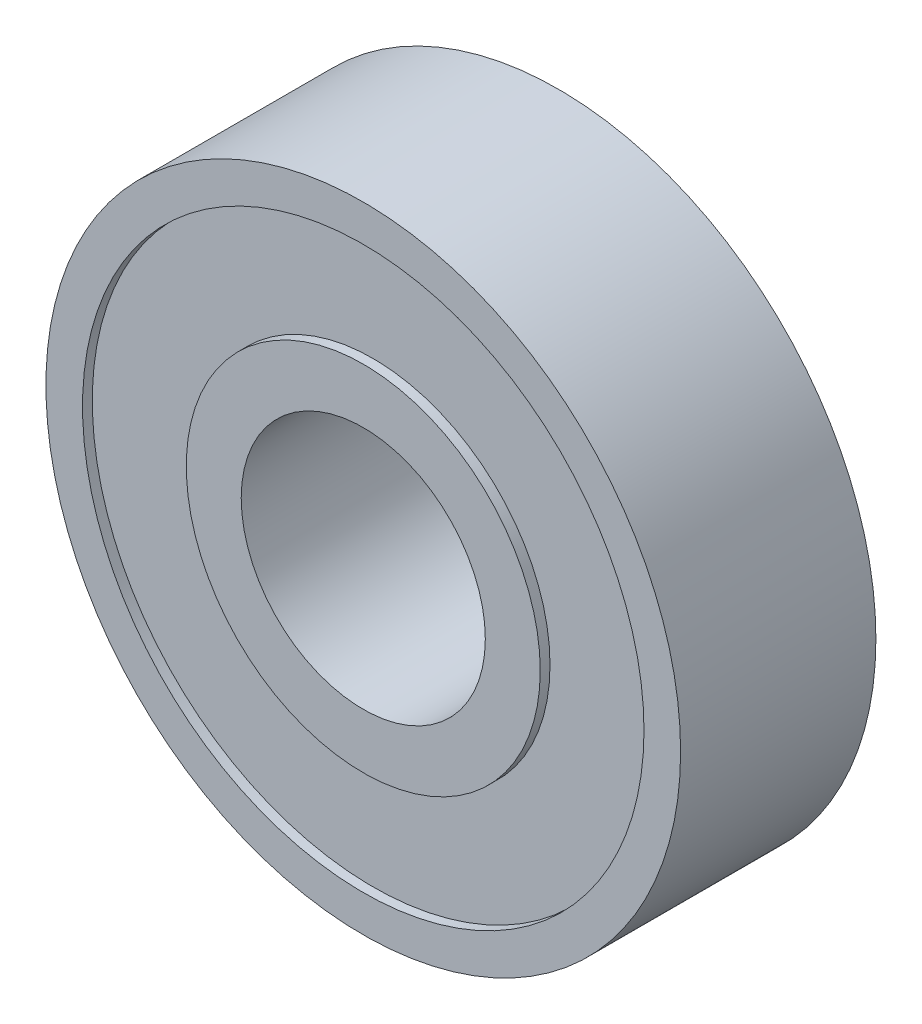
ISO-10303-21;
HEADER;
FILE_DESCRIPTION(('STEP AP214'),'2;1');
FILE_NAME('part.step','',(''),(''),'','','');
FILE_SCHEMA(('AUTOMOTIVE_DESIGN { 1 0 10303 214 1 1 1 1 }'));
ENDSEC;
DATA;
#1=APPLICATION_CONTEXT('core data for automotive mechanical design processes');
#2=APPLICATION_PROTOCOL_DEFINITION('international standard','automotive_design',2000,#1);
#3=PRODUCT_CONTEXT('',#1,'mechanical');
#4=PRODUCT('Part','Part','',(#3));
#5=PRODUCT_RELATED_PRODUCT_CATEGORY('part','',(#4));
#6=PRODUCT_DEFINITION_FORMATION('','',#4);
#7=PRODUCT_DEFINITION_CONTEXT('part definition',#1,'design');
#8=PRODUCT_DEFINITION('design','',#6,#7);
#9=PRODUCT_DEFINITION_SHAPE('','',#8);
#10=(LENGTH_UNIT() NAMED_UNIT(*) SI_UNIT(.MILLI.,.METRE.));
#11=(NAMED_UNIT(*) PLANE_ANGLE_UNIT() SI_UNIT($,.RADIAN.));
#12=(NAMED_UNIT(*) SI_UNIT($,.STERADIAN.) SOLID_ANGLE_UNIT());
#13=UNCERTAINTY_MEASURE_WITH_UNIT(LENGTH_MEASURE(1.E-05),#10,'distance_accuracy_value','');
#14=(GEOMETRIC_REPRESENTATION_CONTEXT(3) GLOBAL_UNCERTAINTY_ASSIGNED_CONTEXT((#13)) GLOBAL_UNIT_ASSIGNED_CONTEXT((#10,
#11,#12)) REPRESENTATION_CONTEXT('',''));
#15=CARTESIAN_POINT('',(0.,0.,0.));
#16=DIRECTION('',(0.,0.,1.));
#17=DIRECTION('',(1.,0.,0.));
#18=AXIS2_PLACEMENT_3D('',#15,#16,#17);
#19=CARTESIAN_POINT('',(0.,0.,-4.));
#20=DIRECTION('',(0.,0.,1.));
#21=DIRECTION('',(1.,0.,0.));
#22=AXIS2_PLACEMENT_3D('',#19,#20,#21);
#23=PLANE('',#22);
#24=CARTESIAN_POINT('',(0.,0.,-4.));
#25=DIRECTION('',(0.,0.,1.));
#26=DIRECTION('',(1.,0.,0.));
#27=AXIS2_PLACEMENT_3D('',#24,#25,#26);
#28=CIRCLE('',#27,13.);
#29=CARTESIAN_POINT('',(13.,0.,-4.));
#30=VERTEX_POINT('',#29);
#31=EDGE_CURVE('E32',#30,#30,#28,.T.);
#32=ORIENTED_EDGE('',*,*,#31,.F.);
#33=EDGE_LOOP('',(#32));
#34=FACE_BOUND('',#33,.T.);
#35=CARTESIAN_POINT('',(0.,0.,-4.));
#36=DIRECTION('',(0.,0.,1.));
#37=DIRECTION('',(1.,0.,0.));
#38=AXIS2_PLACEMENT_3D('',#35,#36,#37);
#39=CIRCLE('',#38,11.5);
#40=CARTESIAN_POINT('',(11.5,0.,-4.));
#41=VERTEX_POINT('',#40);
#42=EDGE_CURVE('E59',#41,#41,#39,.T.);
#43=ORIENTED_EDGE('',*,*,#42,.T.);
#44=EDGE_LOOP('',(#43));
#45=FACE_BOUND('',#44,.T.);
#46=ADVANCED_FACE('F28',(#34,#45),#23,.F.);
#47=CARTESIAN_POINT('',(0.,0.,4.));
#48=DIRECTION('',(0.,0.,1.));
#49=DIRECTION('',(1.,0.,0.));
#50=AXIS2_PLACEMENT_3D('',#47,#48,#49);
#51=PLANE('',#50);
#52=CARTESIAN_POINT('',(0.,0.,4.));
#53=DIRECTION('',(0.,0.,1.));
#54=DIRECTION('',(1.,0.,0.));
#55=AXIS2_PLACEMENT_3D('',#52,#53,#54);
#56=CIRCLE('',#55,5.);
#57=CARTESIAN_POINT('',(5.,0.,4.));
#58=VERTEX_POINT('',#57);
#59=EDGE_CURVE('E39',#58,#58,#56,.T.);
#60=ORIENTED_EDGE('',*,*,#59,.F.);
#61=EDGE_LOOP('',(#60));
#62=FACE_BOUND('',#61,.T.);
#63=CARTESIAN_POINT('',(0.,0.,4.));
#64=DIRECTION('',(0.,0.,1.));
#65=DIRECTION('',(1.,0.,0.));
#66=AXIS2_PLACEMENT_3D('',#63,#64,#65);
#67=CIRCLE('',#66,7.25);
#68=CARTESIAN_POINT('',(7.25,0.,4.));
#69=VERTEX_POINT('',#68);
#70=EDGE_CURVE('E53',#69,#69,#67,.T.);
#71=ORIENTED_EDGE('',*,*,#70,.T.);
#72=EDGE_LOOP('',(#71));
#73=FACE_BOUND('',#72,.T.);
#74=ADVANCED_FACE('F101',(#62,#73),#51,.T.);
#75=CARTESIAN_POINT('',(0.,0.,4.));
#76=DIRECTION('',(0.,0.,1.));
#77=DIRECTION('',(1.,0.,0.));
#78=AXIS2_PLACEMENT_3D('',#75,#76,#77);
#79=CIRCLE('',#78,11.5);
#80=CARTESIAN_POINT('',(11.5,0.,4.));
#81=VERTEX_POINT('',#80);
#82=EDGE_CURVE('E47',#81,#81,#79,.T.);
#83=ORIENTED_EDGE('',*,*,#82,.F.);
#84=EDGE_LOOP('',(#83));
#85=FACE_BOUND('',#84,.T.);
#86=CARTESIAN_POINT('',(0.,0.,4.));
#87=DIRECTION('',(0.,0.,1.));
#88=DIRECTION('',(1.,0.,0.));
#89=AXIS2_PLACEMENT_3D('',#86,#87,#88);
#90=CIRCLE('',#89,13.);
#91=CARTESIAN_POINT('',(13.,0.,4.));
#92=VERTEX_POINT('',#91);
#93=EDGE_CURVE('E10',#92,#92,#90,.T.);
#94=ORIENTED_EDGE('',*,*,#93,.T.);
#95=EDGE_LOOP('',(#94));
#96=FACE_BOUND('',#95,.T.);
#97=ADVANCED_FACE('F83',(#85,#96),#51,.T.);
#98=CARTESIAN_POINT('',(0.,0.,-4.));
#99=DIRECTION('',(0.,0.,1.));
#100=DIRECTION('',(1.,0.,0.));
#101=AXIS2_PLACEMENT_3D('',#98,#99,#100);
#102=CIRCLE('',#101,7.25);
#103=CARTESIAN_POINT('',(7.25,0.,-4.));
#104=VERTEX_POINT('',#103);
#105=EDGE_CURVE('E65',#104,#104,#102,.T.);
#106=ORIENTED_EDGE('',*,*,#105,.F.);
#107=EDGE_LOOP('',(#106));
#108=FACE_BOUND('',#107,.T.);
#109=CARTESIAN_POINT('',(0.,0.,-4.));
#110=DIRECTION('',(0.,0.,1.));
#111=DIRECTION('',(1.,0.,0.));
#112=AXIS2_PLACEMENT_3D('',#109,#110,#111);
#113=CIRCLE('',#112,5.);
#114=CARTESIAN_POINT('',(5.,0.,-4.));
#115=VERTEX_POINT('',#114);
#116=EDGE_CURVE('E41',#115,#115,#113,.T.);
#117=ORIENTED_EDGE('',*,*,#116,.T.);
#118=EDGE_LOOP('',(#117));
#119=FACE_BOUND('',#118,.T.);
#120=ADVANCED_FACE('F80',(#108,#119),#23,.F.);
#121=CARTESIAN_POINT('',(0.,0.,4.));
#122=DIRECTION('',(0.,0.,-1.));
#123=DIRECTION('',(-1.,0.,0.));
#124=AXIS2_PLACEMENT_3D('',#121,#122,#123);
#125=CYLINDRICAL_SURFACE('',#124,13.);
#126=ORIENTED_EDGE('',*,*,#93,.F.);
#127=EDGE_LOOP('',(#126));
#128=FACE_BOUND('',#127,.T.);
#129=ORIENTED_EDGE('',*,*,#31,.T.);
#130=EDGE_LOOP('',(#129));
#131=FACE_BOUND('',#130,.T.);
#132=ADVANCED_FACE('F30',(#128,#131),#125,.T.);
#133=CARTESIAN_POINT('',(0.,0.,4.));
#134=DIRECTION('',(0.,0.,-1.));
#135=DIRECTION('',(-1.,0.,0.));
#136=AXIS2_PLACEMENT_3D('',#133,#134,#135);
#137=CYLINDRICAL_SURFACE('',#136,5.);
#138=ORIENTED_EDGE('',*,*,#59,.T.);
#139=EDGE_LOOP('',(#138));
#140=FACE_BOUND('',#139,.T.);
#141=ORIENTED_EDGE('',*,*,#116,.F.);
#142=EDGE_LOOP('',(#141));
#143=FACE_BOUND('',#142,.T.);
#144=ADVANCED_FACE('F86',(#140,#143),#137,.F.);
#145=CARTESIAN_POINT('',(0.,0.,3.6));
#146=DIRECTION('',(0.,0.,1.));
#147=DIRECTION('',(1.,0.,0.));
#148=AXIS2_PLACEMENT_3D('',#145,#146,#147);
#149=CYLINDRICAL_SURFACE('',#148,11.5);
#150=CARTESIAN_POINT('',(0.,0.,3.6));
#151=DIRECTION('',(0.,0.,1.));
#152=DIRECTION('',(1.,0.,0.));
#153=AXIS2_PLACEMENT_3D('',#150,#151,#152);
#154=CIRCLE('',#153,11.5);
#155=CARTESIAN_POINT('',(11.5,0.,3.6));
#156=VERTEX_POINT('',#155);
#157=EDGE_CURVE('E44',#156,#156,#154,.T.);
#158=ORIENTED_EDGE('',*,*,#157,.F.);
#159=EDGE_LOOP('',(#158));
#160=FACE_BOUND('',#159,.T.);
#161=ORIENTED_EDGE('',*,*,#82,.T.);
#162=EDGE_LOOP('',(#161));
#163=FACE_BOUND('',#162,.T.);
#164=ADVANCED_FACE('F88',(#160,#163),#149,.F.);
#165=CARTESIAN_POINT('',(0.,0.,3.6));
#166=DIRECTION('',(0.,0.,1.));
#167=DIRECTION('',(1.,0.,0.));
#168=AXIS2_PLACEMENT_3D('',#165,#166,#167);
#169=PLANE('',#168);
#170=CARTESIAN_POINT('',(0.,0.,3.6));
#171=DIRECTION('',(0.,0.,1.));
#172=DIRECTION('',(1.,0.,0.));
#173=AXIS2_PLACEMENT_3D('',#170,#171,#172);
#174=CIRCLE('',#173,7.25);
#175=CARTESIAN_POINT('',(7.25,0.,3.6));
#176=VERTEX_POINT('',#175);
#177=EDGE_CURVE('E50',#176,#176,#174,.T.);
#178=ORIENTED_EDGE('',*,*,#177,.F.);
#179=EDGE_LOOP('',(#178));
#180=FACE_BOUND('',#179,.T.);
#181=ORIENTED_EDGE('',*,*,#157,.T.);
#182=EDGE_LOOP('',(#181));
#183=FACE_BOUND('',#182,.T.);
#184=ADVANCED_FACE('F95',(#180,#183),#169,.T.);
#185=CARTESIAN_POINT('',(0.,0.,3.6));
#186=DIRECTION('',(0.,0.,1.));
#187=DIRECTION('',(1.,0.,0.));
#188=AXIS2_PLACEMENT_3D('',#185,#186,#187);
#189=CYLINDRICAL_SURFACE('',#188,7.25);
#190=ORIENTED_EDGE('',*,*,#177,.T.);
#191=EDGE_LOOP('',(#190));
#192=FACE_BOUND('',#191,.T.);
#193=ORIENTED_EDGE('',*,*,#70,.F.);
#194=EDGE_LOOP('',(#193));
#195=FACE_BOUND('',#194,.T.);
#196=ADVANCED_FACE('F149',(#192,#195),#189,.T.);
#197=CARTESIAN_POINT('',(0.,0.,-3.6));
#198=DIRECTION('',(0.,0.,-1.));
#199=DIRECTION('',(1.,0.,0.));
#200=AXIS2_PLACEMENT_3D('',#197,#198,#199);
#201=PLANE('',#200);
#202=CARTESIAN_POINT('',(0.,0.,-3.6));
#203=DIRECTION('',(0.,0.,1.));
#204=DIRECTION('',(1.,0.,0.));
#205=AXIS2_PLACEMENT_3D('',#202,#203,#204);
#206=CIRCLE('',#205,11.5);
#207=CARTESIAN_POINT('',(11.5,0.,-3.6));
#208=VERTEX_POINT('',#207);
#209=EDGE_CURVE('E56',#208,#208,#206,.T.);
#210=ORIENTED_EDGE('',*,*,#209,.F.);
#211=EDGE_LOOP('',(#210));
#212=FACE_BOUND('',#211,.T.);
#213=CARTESIAN_POINT('',(0.,0.,-3.6));
#214=DIRECTION('',(0.,0.,1.));
#215=DIRECTION('',(1.,0.,0.));
#216=AXIS2_PLACEMENT_3D('',#213,#214,#215);
#217=CIRCLE('',#216,7.25);
#218=CARTESIAN_POINT('',(7.25,0.,-3.6));
#219=VERTEX_POINT('',#218);
#220=EDGE_CURVE('E62',#219,#219,#217,.T.);
#221=ORIENTED_EDGE('',*,*,#220,.T.);
#222=EDGE_LOOP('',(#221));
#223=FACE_BOUND('',#222,.T.);
#224=ADVANCED_FACE('F71',(#212,#223),#201,.T.);
#225=CARTESIAN_POINT('',(0.,0.,-3.6));
#226=DIRECTION('',(0.,0.,-1.));
#227=DIRECTION('',(-1.,0.,0.));
#228=AXIS2_PLACEMENT_3D('',#225,#226,#227);
#229=CYLINDRICAL_SURFACE('',#228,11.5);
#230=ORIENTED_EDGE('',*,*,#209,.T.);
#231=EDGE_LOOP('',(#230));
#232=FACE_BOUND('',#231,.T.);
#233=ORIENTED_EDGE('',*,*,#42,.F.);
#234=EDGE_LOOP('',(#233));
#235=FACE_BOUND('',#234,.T.);
#236=ADVANCED_FACE('F76',(#232,#235),#229,.F.);
#237=CARTESIAN_POINT('',(0.,0.,-3.6));
#238=DIRECTION('',(0.,0.,-1.));
#239=DIRECTION('',(-1.,0.,0.));
#240=AXIS2_PLACEMENT_3D('',#237,#238,#239);
#241=CYLINDRICAL_SURFACE('',#240,7.25);
#242=ORIENTED_EDGE('',*,*,#220,.F.);
#243=EDGE_LOOP('',(#242));
#244=FACE_BOUND('',#243,.T.);
#245=ORIENTED_EDGE('',*,*,#105,.T.);
#246=EDGE_LOOP('',(#245));
#247=FACE_BOUND('',#246,.T.);
#248=ADVANCED_FACE('F73',(#244,#247),#241,.T.);
#249=CLOSED_SHELL('',(#46,#74,#97,#120,#132,#144,#164,#184,#196,#224,#236,#248));
#250=MANIFOLD_SOLID_BREP('B2',#249);
#251=ADVANCED_BREP_SHAPE_REPRESENTATION('',(#18,#250),#14);
#252=SHAPE_DEFINITION_REPRESENTATION(#9,#251);
ENDSEC;
END-ISO-10303-21;
